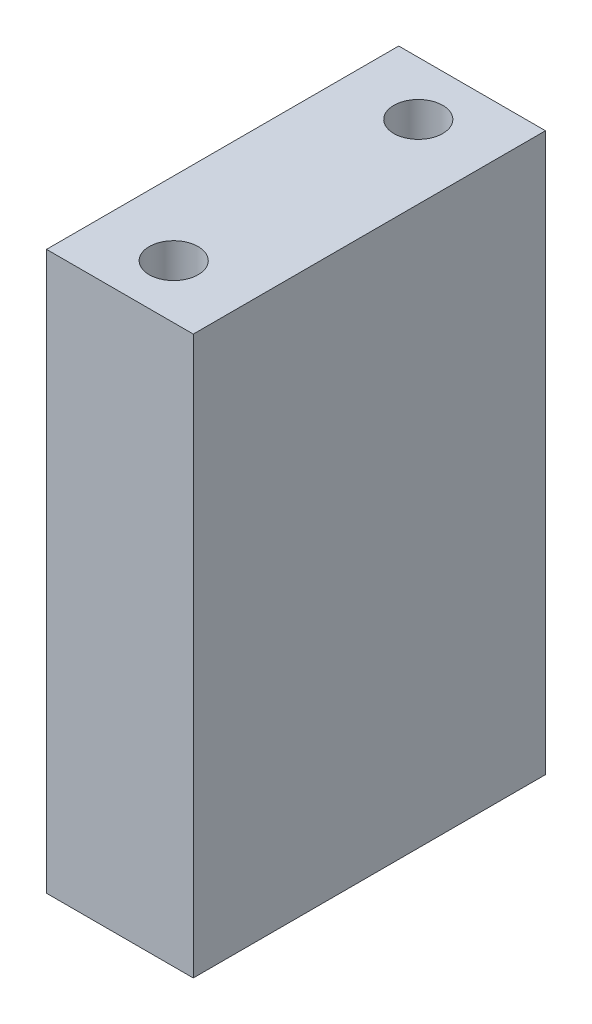
ISO-10303-21;
HEADER;
FILE_DESCRIPTION(('STEP AP214'),'2;1');
FILE_NAME('part.step','',(''),(''),'','','');
FILE_SCHEMA(('AUTOMOTIVE_DESIGN { 1 0 10303 214 1 1 1 1 }'));
ENDSEC;
DATA;
#1=APPLICATION_CONTEXT('core data for automotive mechanical design processes');
#2=APPLICATION_PROTOCOL_DEFINITION('international standard','automotive_design',2000,#1);
#3=PRODUCT_CONTEXT('',#1,'mechanical');
#4=PRODUCT('Part','Part','',(#3));
#5=PRODUCT_RELATED_PRODUCT_CATEGORY('part','',(#4));
#6=PRODUCT_DEFINITION_FORMATION('','',#4);
#7=PRODUCT_DEFINITION_CONTEXT('part definition',#1,'design');
#8=PRODUCT_DEFINITION('design','',#6,#7);
#9=PRODUCT_DEFINITION_SHAPE('','',#8);
#10=(LENGTH_UNIT() NAMED_UNIT(*) SI_UNIT(.MILLI.,.METRE.));
#11=(NAMED_UNIT(*) PLANE_ANGLE_UNIT() SI_UNIT($,.RADIAN.));
#12=(NAMED_UNIT(*) SI_UNIT($,.STERADIAN.) SOLID_ANGLE_UNIT());
#13=UNCERTAINTY_MEASURE_WITH_UNIT(LENGTH_MEASURE(1.E-05),#10,'distance_accuracy_value','');
#14=(GEOMETRIC_REPRESENTATION_CONTEXT(3) GLOBAL_UNCERTAINTY_ASSIGNED_CONTEXT((#13)) GLOBAL_UNIT_ASSIGNED_CONTEXT((#10,
#11,#12)) REPRESENTATION_CONTEXT('',''));
#15=CARTESIAN_POINT('',(0.,0.,0.));
#16=DIRECTION('',(0.,0.,1.));
#17=DIRECTION('',(1.,0.,0.));
#18=AXIS2_PLACEMENT_3D('',#15,#16,#17);
#19=CARTESIAN_POINT('',(7.49999999999999,-57.,-18.));
#20=DIRECTION('',(1.,0.,0.));
#21=DIRECTION('',(0.,0.,-1.));
#22=AXIS2_PLACEMENT_3D('',#19,#20,#21);
#23=PLANE('',#22);
#24=DIRECTION('',(0.,0.,-1.));
#25=VECTOR('',#24,1.);
#26=CARTESIAN_POINT('',(7.49999999999999,0.,-18.));
#27=LINE('',#26,#25);
#28=CARTESIAN_POINT('',(7.5,0.,18.));
#29=VERTEX_POINT('',#28);
#30=CARTESIAN_POINT('',(7.49999999999999,0.,-18.));
#31=VERTEX_POINT('',#30);
#32=EDGE_CURVE('E124',#29,#31,#27,.T.);
#33=ORIENTED_EDGE('',*,*,#32,.F.);
#34=DIRECTION('',(0.,1.,0.));
#35=VECTOR('',#34,1.);
#36=CARTESIAN_POINT('',(7.5,-57.,18.));
#37=LINE('',#36,#35);
#38=CARTESIAN_POINT('',(7.5,-57.,18.));
#39=VERTEX_POINT('',#38);
#40=EDGE_CURVE('E11',#39,#29,#37,.T.);
#41=ORIENTED_EDGE('',*,*,#40,.F.);
#42=DIRECTION('',(0.,0.,-1.));
#43=VECTOR('',#42,1.);
#44=CARTESIAN_POINT('',(7.49999999999999,-57.,-18.));
#45=LINE('',#44,#43);
#46=CARTESIAN_POINT('',(7.49999999999999,-57.,-18.));
#47=VERTEX_POINT('',#46);
#48=EDGE_CURVE('E125',#39,#47,#45,.T.);
#49=ORIENTED_EDGE('',*,*,#48,.T.);
#50=DIRECTION('',(0.,1.,0.));
#51=VECTOR('',#50,1.);
#52=CARTESIAN_POINT('',(7.49999999999999,-57.,-18.));
#53=LINE('',#52,#51);
#54=EDGE_CURVE('E54',#47,#31,#53,.T.);
#55=ORIENTED_EDGE('',*,*,#54,.T.);
#56=EDGE_LOOP('',(#33,#41,#49,#55));
#57=FACE_BOUND('',#56,.T.);
#58=ADVANCED_FACE('F51',(#57),#23,.T.);
#59=CARTESIAN_POINT('',(-7.5,-57.,18.));
#60=DIRECTION('',(0.,0.,1.));
#61=DIRECTION('',(1.,0.,0.));
#62=AXIS2_PLACEMENT_3D('',#59,#60,#61);
#63=PLANE('',#62);
#64=DIRECTION('',(1.,0.,0.));
#65=VECTOR('',#64,1.);
#66=CARTESIAN_POINT('',(-7.5,0.,18.));
#67=LINE('',#66,#65);
#68=CARTESIAN_POINT('',(-7.5,0.,18.));
#69=VERTEX_POINT('',#68);
#70=EDGE_CURVE('E128',#69,#29,#67,.T.);
#71=ORIENTED_EDGE('',*,*,#70,.F.);
#72=DIRECTION('',(0.,1.,0.));
#73=VECTOR('',#72,1.);
#74=CARTESIAN_POINT('',(-7.5,-57.,18.));
#75=LINE('',#74,#73);
#76=CARTESIAN_POINT('',(-7.5,-57.,18.));
#77=VERTEX_POINT('',#76);
#78=EDGE_CURVE('E60',#77,#69,#75,.T.);
#79=ORIENTED_EDGE('',*,*,#78,.F.);
#80=DIRECTION('',(1.,0.,0.));
#81=VECTOR('',#80,1.);
#82=CARTESIAN_POINT('',(-7.5,-57.,18.));
#83=LINE('',#82,#81);
#84=EDGE_CURVE('E132',#77,#39,#83,.T.);
#85=ORIENTED_EDGE('',*,*,#84,.T.);
#86=ORIENTED_EDGE('',*,*,#40,.T.);
#87=EDGE_LOOP('',(#71,#79,#85,#86));
#88=FACE_BOUND('',#87,.T.);
#89=ADVANCED_FACE('F147',(#88),#63,.T.);
#90=CARTESIAN_POINT('',(-7.50000000000001,-57.,-18.));
#91=DIRECTION('',(-1.,0.,0.));
#92=DIRECTION('',(0.,0.,1.));
#93=AXIS2_PLACEMENT_3D('',#90,#91,#92);
#94=PLANE('',#93);
#95=DIRECTION('',(0.,0.,1.));
#96=VECTOR('',#95,1.);
#97=CARTESIAN_POINT('',(-7.50000000000001,0.,-18.));
#98=LINE('',#97,#96);
#99=CARTESIAN_POINT('',(-7.50000000000001,0.,-18.));
#100=VERTEX_POINT('',#99);
#101=EDGE_CURVE('E139',#100,#69,#98,.T.);
#102=ORIENTED_EDGE('',*,*,#101,.F.);
#103=DIRECTION('',(0.,1.,0.));
#104=VECTOR('',#103,1.);
#105=CARTESIAN_POINT('',(-7.50000000000001,-57.,-18.));
#106=LINE('',#105,#104);
#107=CARTESIAN_POINT('',(-7.50000000000001,-57.,-18.));
#108=VERTEX_POINT('',#107);
#109=EDGE_CURVE('E143',#108,#100,#106,.T.);
#110=ORIENTED_EDGE('',*,*,#109,.F.);
#111=DIRECTION('',(0.,0.,1.));
#112=VECTOR('',#111,1.);
#113=CARTESIAN_POINT('',(-7.50000000000001,-57.,-18.));
#114=LINE('',#113,#112);
#115=EDGE_CURVE('E130',#108,#77,#114,.T.);
#116=ORIENTED_EDGE('',*,*,#115,.T.);
#117=ORIENTED_EDGE('',*,*,#78,.T.);
#118=EDGE_LOOP('',(#102,#110,#116,#117));
#119=FACE_BOUND('',#118,.T.);
#120=ADVANCED_FACE('F150',(#119),#94,.T.);
#121=CARTESIAN_POINT('',(-7.50000000000001,-57.,-18.));
#122=DIRECTION('',(0.,0.,-1.));
#123=DIRECTION('',(-1.,0.,0.));
#124=AXIS2_PLACEMENT_3D('',#121,#122,#123);
#125=PLANE('',#124);
#126=DIRECTION('',(-1.,0.,0.));
#127=VECTOR('',#126,1.);
#128=CARTESIAN_POINT('',(-7.50000000000001,0.,-18.));
#129=LINE('',#128,#127);
#130=EDGE_CURVE('E136',#31,#100,#129,.T.);
#131=ORIENTED_EDGE('',*,*,#130,.F.);
#132=ORIENTED_EDGE('',*,*,#54,.F.);
#133=DIRECTION('',(-1.,0.,0.));
#134=VECTOR('',#133,1.);
#135=CARTESIAN_POINT('',(-7.50000000000001,-57.,-18.));
#136=LINE('',#135,#134);
#137=EDGE_CURVE('E127',#47,#108,#136,.T.);
#138=ORIENTED_EDGE('',*,*,#137,.T.);
#139=ORIENTED_EDGE('',*,*,#109,.T.);
#140=EDGE_LOOP('',(#131,#132,#138,#139));
#141=FACE_BOUND('',#140,.T.);
#142=ADVANCED_FACE('F144',(#141),#125,.T.);
#143=CARTESIAN_POINT('',(0.,-57.,0.));
#144=DIRECTION('',(0.,1.,0.));
#145=DIRECTION('',(0.,0.,1.));
#146=AXIS2_PLACEMENT_3D('',#143,#144,#145);
#147=PLANE('',#146);
#148=ORIENTED_EDGE('',*,*,#48,.F.);
#149=ORIENTED_EDGE('',*,*,#84,.F.);
#150=ORIENTED_EDGE('',*,*,#115,.F.);
#151=ORIENTED_EDGE('',*,*,#137,.F.);
#152=EDGE_LOOP('',(#148,#149,#150,#151));
#153=FACE_BOUND('',#152,.T.);
#154=ADVANCED_FACE('F152',(#153),#147,.F.);
#155=CARTESIAN_POINT('',(0.,0.,0.));
#156=DIRECTION('',(0.,1.,0.));
#157=DIRECTION('',(0.,0.,1.));
#158=AXIS2_PLACEMENT_3D('',#155,#156,#157);
#159=PLANE('',#158);
#160=CARTESIAN_POINT('',(0.,0.,-12.5));
#161=DIRECTION('',(0.,1.,0.));
#162=DIRECTION('',(0.,0.,1.));
#163=AXIS2_PLACEMENT_3D('',#160,#161,#162);
#164=CIRCLE('',#163,2.49999999999999);
#165=CARTESIAN_POINT('',(0.,0.,-10.));
#166=VERTEX_POINT('',#165);
#167=EDGE_CURVE('E114',#166,#166,#164,.T.);
#168=ORIENTED_EDGE('',*,*,#167,.F.);
#169=EDGE_LOOP('',(#168));
#170=FACE_BOUND('',#169,.T.);
#171=CARTESIAN_POINT('',(0.,0.,12.5));
#172=DIRECTION('',(0.,1.,0.));
#173=DIRECTION('',(0.,0.,1.));
#174=AXIS2_PLACEMENT_3D('',#171,#172,#173);
#175=CIRCLE('',#174,2.49999999999999);
#176=CARTESIAN_POINT('',(0.,0.,15.));
#177=VERTEX_POINT('',#176);
#178=EDGE_CURVE('E113',#177,#177,#175,.T.);
#179=ORIENTED_EDGE('',*,*,#178,.F.);
#180=EDGE_LOOP('',(#179));
#181=FACE_BOUND('',#180,.T.);
#182=ORIENTED_EDGE('',*,*,#32,.T.);
#183=ORIENTED_EDGE('',*,*,#130,.T.);
#184=ORIENTED_EDGE('',*,*,#101,.T.);
#185=ORIENTED_EDGE('',*,*,#70,.T.);
#186=EDGE_LOOP('',(#182,#183,#184,#185));
#187=FACE_BOUND('',#186,.T.);
#188=ADVANCED_FACE('F146',(#170,#181,#187),#159,.T.);
#189=CARTESIAN_POINT('',(0.,-15.,12.5));
#190=DIRECTION('',(0.,1.,0.));
#191=DIRECTION('',(0.,0.,1.));
#192=AXIS2_PLACEMENT_3D('',#189,#190,#191);
#193=CONICAL_SURFACE('',#192,2.49999999999999,1.02974425867665);
#194=CARTESIAN_POINT('',(0.,-16.5021515475689,12.5));
#195=VERTEX_POINT('',#194);
#196=VERTEX_LOOP('',#195);
#197=FACE_BOUND('',#196,.T.);
#198=CARTESIAN_POINT('',(0.,-15.,12.5));
#199=DIRECTION('',(0.,1.,0.));
#200=DIRECTION('',(0.,0.,1.));
#201=AXIS2_PLACEMENT_3D('',#198,#199,#200);
#202=CIRCLE('',#201,2.49999999999999);
#203=CARTESIAN_POINT('',(0.,-15.,15.));
#204=VERTEX_POINT('',#203);
#205=EDGE_CURVE('E117',#204,#204,#202,.T.);
#206=ORIENTED_EDGE('',*,*,#205,.T.);
#207=EDGE_LOOP('',(#206));
#208=FACE_BOUND('',#207,.T.);
#209=ADVANCED_FACE('F160',(#197,#208),#193,.F.);
#210=CARTESIAN_POINT('',(0.,0.,12.5));
#211=DIRECTION('',(0.,1.,0.));
#212=DIRECTION('',(0.,0.,1.));
#213=AXIS2_PLACEMENT_3D('',#210,#211,#212);
#214=CYLINDRICAL_SURFACE('',#213,2.49999999999999);
#215=ORIENTED_EDGE('',*,*,#205,.F.);
#216=EDGE_LOOP('',(#215));
#217=FACE_BOUND('',#216,.T.);
#218=ORIENTED_EDGE('',*,*,#178,.T.);
#219=EDGE_LOOP('',(#218));
#220=FACE_BOUND('',#219,.T.);
#221=ADVANCED_FACE('F107',(#217,#220),#214,.F.);
#222=CARTESIAN_POINT('',(0.,-15.,-12.5));
#223=DIRECTION('',(0.,1.,0.));
#224=DIRECTION('',(0.,0.,1.));
#225=AXIS2_PLACEMENT_3D('',#222,#223,#224);
#226=CONICAL_SURFACE('',#225,2.49999999999999,1.02974425867665);
#227=CARTESIAN_POINT('',(0.,-16.5021515475689,-12.5));
#228=VERTEX_POINT('',#227);
#229=VERTEX_LOOP('',#228);
#230=FACE_BOUND('',#229,.T.);
#231=CARTESIAN_POINT('',(0.,-15.,-12.5));
#232=DIRECTION('',(0.,1.,0.));
#233=DIRECTION('',(0.,0.,1.));
#234=AXIS2_PLACEMENT_3D('',#231,#232,#233);
#235=CIRCLE('',#234,2.49999999999999);
#236=CARTESIAN_POINT('',(0.,-15.,-10.));
#237=VERTEX_POINT('',#236);
#238=EDGE_CURVE('E111',#237,#237,#235,.T.);
#239=ORIENTED_EDGE('',*,*,#238,.T.);
#240=EDGE_LOOP('',(#239));
#241=FACE_BOUND('',#240,.T.);
#242=ADVANCED_FACE('F103',(#230,#241),#226,.F.);
#243=CARTESIAN_POINT('',(0.,0.,-12.5));
#244=DIRECTION('',(0.,1.,0.));
#245=DIRECTION('',(0.,0.,1.));
#246=AXIS2_PLACEMENT_3D('',#243,#244,#245);
#247=CYLINDRICAL_SURFACE('',#246,2.49999999999999);
#248=ORIENTED_EDGE('',*,*,#238,.F.);
#249=EDGE_LOOP('',(#248));
#250=FACE_BOUND('',#249,.T.);
#251=ORIENTED_EDGE('',*,*,#167,.T.);
#252=EDGE_LOOP('',(#251));
#253=FACE_BOUND('',#252,.T.);
#254=ADVANCED_FACE('F106',(#250,#253),#247,.F.);
#255=CLOSED_SHELL('',(#58,#89,#120,#142,#154,#188,#209,#221,#242,#254));
#256=MANIFOLD_SOLID_BREP('B2',#255);
#257=ADVANCED_BREP_SHAPE_REPRESENTATION('',(#18,#256),#14);
#258=SHAPE_DEFINITION_REPRESENTATION(#9,#257);
ENDSEC;
END-ISO-10303-21;
